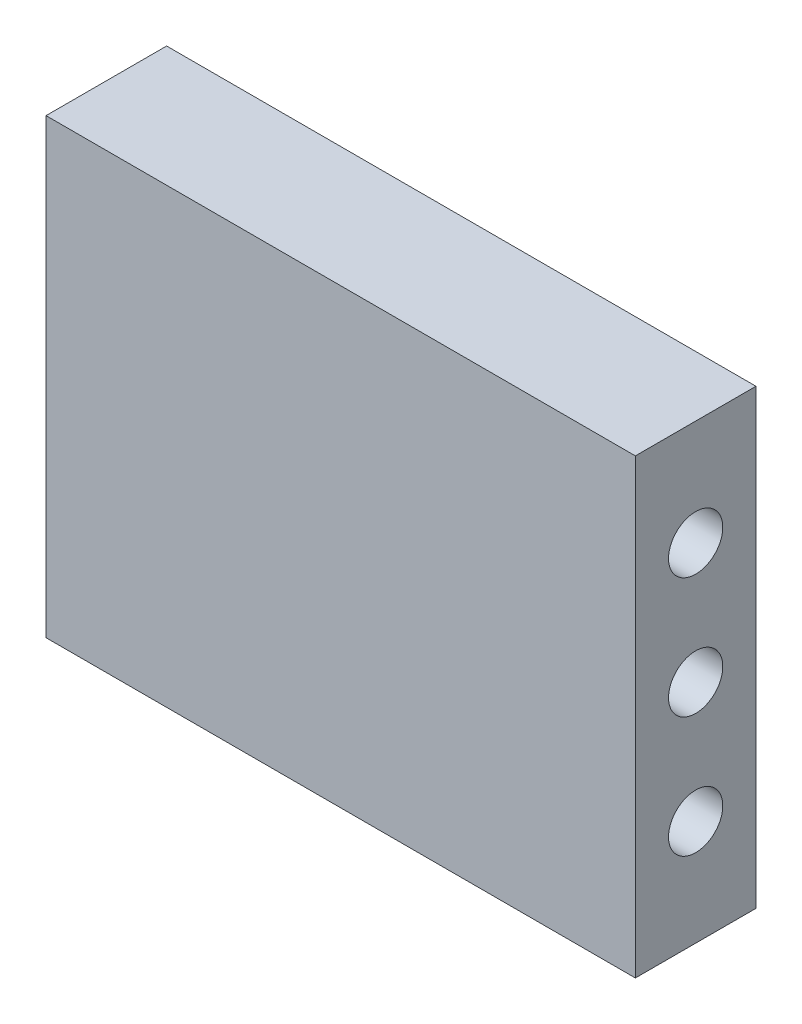
ISO-10303-21;
HEADER;
FILE_DESCRIPTION(('STEP AP214'),'2;1');
FILE_NAME('part.step','',(''),(''),'','','');
FILE_SCHEMA(('AUTOMOTIVE_DESIGN { 1 0 10303 214 1 1 1 1 }'));
ENDSEC;
DATA;
#1=APPLICATION_CONTEXT('core data for automotive mechanical design processes');
#2=APPLICATION_PROTOCOL_DEFINITION('international standard','automotive_design',2000,#1);
#3=PRODUCT_CONTEXT('',#1,'mechanical');
#4=PRODUCT('Part','Part','',(#3));
#5=PRODUCT_RELATED_PRODUCT_CATEGORY('part','',(#4));
#6=PRODUCT_DEFINITION_FORMATION('','',#4);
#7=PRODUCT_DEFINITION_CONTEXT('part definition',#1,'design');
#8=PRODUCT_DEFINITION('design','',#6,#7);
#9=PRODUCT_DEFINITION_SHAPE('','',#8);
#10=(LENGTH_UNIT() NAMED_UNIT(*) SI_UNIT(.MILLI.,.METRE.));
#11=(NAMED_UNIT(*) PLANE_ANGLE_UNIT() SI_UNIT($,.RADIAN.));
#12=(NAMED_UNIT(*) SI_UNIT($,.STERADIAN.) SOLID_ANGLE_UNIT());
#13=UNCERTAINTY_MEASURE_WITH_UNIT(LENGTH_MEASURE(1.E-05),#10,'distance_accuracy_value','');
#14=(GEOMETRIC_REPRESENTATION_CONTEXT(3) GLOBAL_UNCERTAINTY_ASSIGNED_CONTEXT((#13)) GLOBAL_UNIT_ASSIGNED_CONTEXT((#10,
#11,#12)) REPRESENTATION_CONTEXT('',''));
#15=CARTESIAN_POINT('',(0.,0.,0.));
#16=DIRECTION('',(0.,0.,1.));
#17=DIRECTION('',(1.,0.,0.));
#18=AXIS2_PLACEMENT_3D('',#15,#16,#17);
#19=CARTESIAN_POINT('',(-3.702544364314,11.890243902439,8.));
#20=DIRECTION('',(1.,0.,0.));
#21=DIRECTION('',(0.,0.,-1.));
#22=AXIS2_PLACEMENT_3D('',#19,#20,#21);
#23=PLANE('',#22);
#24=CARTESIAN_POINT('',(-3.702544364314,4.89024390243903,4.));
#25=DIRECTION('',(-1.,0.,0.));
#26=DIRECTION('',(0.,0.,1.));
#27=AXIS2_PLACEMENT_3D('',#24,#25,#26);
#28=CIRCLE('',#27,1.8);
#29=CARTESIAN_POINT('',(-3.702544364314,4.89024390243903,5.8));
#30=VERTEX_POINT('',#29);
#31=EDGE_CURVE('E144',#30,#30,#28,.T.);
#32=ORIENTED_EDGE('',*,*,#31,.F.);
#33=EDGE_LOOP('',(#32));
#34=FACE_BOUND('',#33,.T.);
#35=CARTESIAN_POINT('',(-3.702544364314,-3.10975609756097,4.));
#36=DIRECTION('',(-1.,0.,0.));
#37=DIRECTION('',(0.,0.,1.));
#38=AXIS2_PLACEMENT_3D('',#35,#36,#37);
#39=CIRCLE('',#38,1.8);
#40=CARTESIAN_POINT('',(-3.702544364314,-3.10975609756097,5.8));
#41=VERTEX_POINT('',#40);
#42=EDGE_CURVE('E136',#41,#41,#39,.T.);
#43=ORIENTED_EDGE('',*,*,#42,.F.);
#44=EDGE_LOOP('',(#43));
#45=FACE_BOUND('',#44,.T.);
#46=CARTESIAN_POINT('',(-3.702544364314,-11.109756097561,4.));
#47=DIRECTION('',(-1.,0.,0.));
#48=DIRECTION('',(0.,0.,1.));
#49=AXIS2_PLACEMENT_3D('',#46,#47,#48);
#50=CIRCLE('',#49,1.8);
#51=CARTESIAN_POINT('',(-3.702544364314,-11.109756097561,5.8));
#52=VERTEX_POINT('',#51);
#53=EDGE_CURVE('E128',#52,#52,#50,.T.);
#54=ORIENTED_EDGE('',*,*,#53,.F.);
#55=EDGE_LOOP('',(#54));
#56=FACE_BOUND('',#55,.T.);
#57=DIRECTION('',(0.,-1.,0.));
#58=VECTOR('',#57,1.);
#59=CARTESIAN_POINT('',(-3.702544364314,11.890243902439,0.));
#60=LINE('',#59,#58);
#61=CARTESIAN_POINT('',(-3.702544364314,11.890243902439,0.));
#62=VERTEX_POINT('',#61);
#63=CARTESIAN_POINT('',(-3.702544364314,-18.109756097561,0.));
#64=VERTEX_POINT('',#63);
#65=EDGE_CURVE('E107',#62,#64,#60,.T.);
#66=ORIENTED_EDGE('',*,*,#65,.T.);
#67=DIRECTION('',(0.,0.,-1.));
#68=VECTOR('',#67,1.);
#69=CARTESIAN_POINT('',(-3.702544364314,-18.109756097561,8.));
#70=LINE('',#69,#68);
#71=CARTESIAN_POINT('',(-3.702544364314,-18.109756097561,8.));
#72=VERTEX_POINT('',#71);
#73=EDGE_CURVE('E11',#72,#64,#70,.T.);
#74=ORIENTED_EDGE('',*,*,#73,.F.);
#75=DIRECTION('',(0.,-1.,0.));
#76=VECTOR('',#75,1.);
#77=CARTESIAN_POINT('',(-3.702544364314,11.890243902439,8.));
#78=LINE('',#77,#76);
#79=CARTESIAN_POINT('',(-3.702544364314,11.890243902439,8.));
#80=VERTEX_POINT('',#79);
#81=EDGE_CURVE('E91',#80,#72,#78,.T.);
#82=ORIENTED_EDGE('',*,*,#81,.F.);
#83=DIRECTION('',(0.,0.,-1.));
#84=VECTOR('',#83,1.);
#85=CARTESIAN_POINT('',(-3.702544364314,11.890243902439,8.));
#86=LINE('',#85,#84);
#87=EDGE_CURVE('E103',#80,#62,#86,.T.);
#88=ORIENTED_EDGE('',*,*,#87,.T.);
#89=EDGE_LOOP('',(#66,#74,#82,#88));
#90=FACE_BOUND('',#89,.T.);
#91=ADVANCED_FACE('F39',(#34,#45,#56,#90),#23,.F.);
#92=CARTESIAN_POINT('',(-3.702544364314,-18.109756097561,8.));
#93=DIRECTION('',(0.,1.,0.));
#94=DIRECTION('',(0.,0.,1.));
#95=AXIS2_PLACEMENT_3D('',#92,#93,#94);
#96=PLANE('',#95);
#97=DIRECTION('',(1.,0.,0.));
#98=VECTOR('',#97,1.);
#99=CARTESIAN_POINT('',(-3.702544364314,-18.109756097561,0.));
#100=LINE('',#99,#98);
#101=CARTESIAN_POINT('',(35.397455635686,-18.109756097561,0.));
#102=VERTEX_POINT('',#101);
#103=EDGE_CURVE('E96',#64,#102,#100,.T.);
#104=ORIENTED_EDGE('',*,*,#103,.T.);
#105=DIRECTION('',(0.,0.,-1.));
#106=VECTOR('',#105,1.);
#107=CARTESIAN_POINT('',(35.397455635686,-18.109756097561,8.));
#108=LINE('',#107,#106);
#109=CARTESIAN_POINT('',(35.397455635686,-18.109756097561,8.));
#110=VERTEX_POINT('',#109);
#111=EDGE_CURVE('E48',#110,#102,#108,.T.);
#112=ORIENTED_EDGE('',*,*,#111,.F.);
#113=DIRECTION('',(1.,0.,0.));
#114=VECTOR('',#113,1.);
#115=CARTESIAN_POINT('',(-3.702544364314,-18.109756097561,8.));
#116=LINE('',#115,#114);
#117=EDGE_CURVE('E86',#72,#110,#116,.T.);
#118=ORIENTED_EDGE('',*,*,#117,.F.);
#119=ORIENTED_EDGE('',*,*,#73,.T.);
#120=EDGE_LOOP('',(#104,#112,#118,#119));
#121=FACE_BOUND('',#120,.T.);
#122=ADVANCED_FACE('F95',(#121),#96,.F.);
#123=CARTESIAN_POINT('',(35.397455635686,11.890243902439,8.));
#124=DIRECTION('',(-1.,0.,0.));
#125=DIRECTION('',(0.,0.,1.));
#126=AXIS2_PLACEMENT_3D('',#123,#124,#125);
#127=PLANE('',#126);
#128=CARTESIAN_POINT('',(35.397455635686,4.89024390243903,4.));
#129=DIRECTION('',(-1.,0.,0.));
#130=DIRECTION('',(0.,0.,1.));
#131=AXIS2_PLACEMENT_3D('',#128,#129,#130);
#132=CIRCLE('',#131,1.8);
#133=CARTESIAN_POINT('',(35.397455635686,4.89024390243903,5.8));
#134=VERTEX_POINT('',#133);
#135=EDGE_CURVE('E111',#134,#134,#132,.T.);
#136=ORIENTED_EDGE('',*,*,#135,.T.);
#137=EDGE_LOOP('',(#136));
#138=FACE_BOUND('',#137,.T.);
#139=CARTESIAN_POINT('',(35.397455635686,-3.10975609756097,4.));
#140=DIRECTION('',(-1.,0.,0.));
#141=DIRECTION('',(0.,0.,1.));
#142=AXIS2_PLACEMENT_3D('',#139,#140,#141);
#143=CIRCLE('',#142,1.8);
#144=CARTESIAN_POINT('',(35.397455635686,-3.10975609756097,5.8));
#145=VERTEX_POINT('',#144);
#146=EDGE_CURVE('E140',#145,#145,#143,.T.);
#147=ORIENTED_EDGE('',*,*,#146,.T.);
#148=EDGE_LOOP('',(#147));
#149=FACE_BOUND('',#148,.T.);
#150=CARTESIAN_POINT('',(35.397455635686,-11.109756097561,4.));
#151=DIRECTION('',(-1.,0.,0.));
#152=DIRECTION('',(0.,0.,1.));
#153=AXIS2_PLACEMENT_3D('',#150,#151,#152);
#154=CIRCLE('',#153,1.8);
#155=CARTESIAN_POINT('',(35.397455635686,-11.109756097561,5.8));
#156=VERTEX_POINT('',#155);
#157=EDGE_CURVE('E132',#156,#156,#154,.T.);
#158=ORIENTED_EDGE('',*,*,#157,.T.);
#159=EDGE_LOOP('',(#158));
#160=FACE_BOUND('',#159,.T.);
#161=DIRECTION('',(0.,1.,0.));
#162=VECTOR('',#161,1.);
#163=CARTESIAN_POINT('',(35.397455635686,11.890243902439,0.));
#164=LINE('',#163,#162);
#165=CARTESIAN_POINT('',(35.397455635686,11.890243902439,0.));
#166=VERTEX_POINT('',#165);
#167=EDGE_CURVE('E73',#102,#166,#164,.T.);
#168=ORIENTED_EDGE('',*,*,#167,.T.);
#169=DIRECTION('',(0.,0.,-1.));
#170=VECTOR('',#169,1.);
#171=CARTESIAN_POINT('',(35.397455635686,11.890243902439,8.));
#172=LINE('',#171,#170);
#173=CARTESIAN_POINT('',(35.397455635686,11.890243902439,8.));
#174=VERTEX_POINT('',#173);
#175=EDGE_CURVE('E98',#174,#166,#172,.T.);
#176=ORIENTED_EDGE('',*,*,#175,.F.);
#177=DIRECTION('',(0.,1.,0.));
#178=VECTOR('',#177,1.);
#179=CARTESIAN_POINT('',(35.397455635686,11.890243902439,8.));
#180=LINE('',#179,#178);
#181=EDGE_CURVE('E89',#110,#174,#180,.T.);
#182=ORIENTED_EDGE('',*,*,#181,.F.);
#183=ORIENTED_EDGE('',*,*,#111,.T.);
#184=EDGE_LOOP('',(#168,#176,#182,#183));
#185=FACE_BOUND('',#184,.T.);
#186=ADVANCED_FACE('F99',(#138,#149,#160,#185),#127,.F.);
#187=CARTESIAN_POINT('',(-3.702544364314,11.890243902439,8.));
#188=DIRECTION('',(0.,-1.,0.));
#189=DIRECTION('',(1.,0.,0.));
#190=AXIS2_PLACEMENT_3D('',#187,#188,#189);
#191=PLANE('',#190);
#192=DIRECTION('',(-1.,0.,0.));
#193=VECTOR('',#192,1.);
#194=CARTESIAN_POINT('',(-3.702544364314,11.890243902439,0.));
#195=LINE('',#194,#193);
#196=EDGE_CURVE('E79',#166,#62,#195,.T.);
#197=ORIENTED_EDGE('',*,*,#196,.T.);
#198=ORIENTED_EDGE('',*,*,#87,.F.);
#199=DIRECTION('',(-1.,0.,0.));
#200=VECTOR('',#199,1.);
#201=CARTESIAN_POINT('',(-3.702544364314,11.890243902439,8.));
#202=LINE('',#201,#200);
#203=EDGE_CURVE('E56',#174,#80,#202,.T.);
#204=ORIENTED_EDGE('',*,*,#203,.F.);
#205=ORIENTED_EDGE('',*,*,#175,.T.);
#206=EDGE_LOOP('',(#197,#198,#204,#205));
#207=FACE_BOUND('',#206,.T.);
#208=ADVANCED_FACE('F121',(#207),#191,.F.);
#209=CARTESIAN_POINT('',(0.,0.,8.));
#210=DIRECTION('',(0.,0.,1.));
#211=DIRECTION('',(1.,0.,0.));
#212=AXIS2_PLACEMENT_3D('',#209,#210,#211);
#213=PLANE('',#212);
#214=ORIENTED_EDGE('',*,*,#81,.T.);
#215=ORIENTED_EDGE('',*,*,#117,.T.);
#216=ORIENTED_EDGE('',*,*,#181,.T.);
#217=ORIENTED_EDGE('',*,*,#203,.T.);
#218=EDGE_LOOP('',(#214,#215,#216,#217));
#219=FACE_BOUND('',#218,.T.);
#220=ADVANCED_FACE('F87',(#219),#213,.T.);
#221=CARTESIAN_POINT('',(0.,0.,0.));
#222=DIRECTION('',(0.,0.,1.));
#223=DIRECTION('',(1.,0.,0.));
#224=AXIS2_PLACEMENT_3D('',#221,#222,#223);
#225=PLANE('',#224);
#226=ORIENTED_EDGE('',*,*,#65,.F.);
#227=ORIENTED_EDGE('',*,*,#196,.F.);
#228=ORIENTED_EDGE('',*,*,#167,.F.);
#229=ORIENTED_EDGE('',*,*,#103,.F.);
#230=EDGE_LOOP('',(#226,#227,#228,#229));
#231=FACE_BOUND('',#230,.T.);
#232=ADVANCED_FACE('F124',(#231),#225,.F.);
#233=CARTESIAN_POINT('',(35.397455635686,-11.109756097561,4.));
#234=DIRECTION('',(-1.,0.,0.));
#235=DIRECTION('',(0.,0.,1.));
#236=AXIS2_PLACEMENT_3D('',#233,#234,#235);
#237=CYLINDRICAL_SURFACE('',#236,1.8);
#238=ORIENTED_EDGE('',*,*,#157,.F.);
#239=EDGE_LOOP('',(#238));
#240=FACE_BOUND('',#239,.T.);
#241=ORIENTED_EDGE('',*,*,#53,.T.);
#242=EDGE_LOOP('',(#241));
#243=FACE_BOUND('',#242,.T.);
#244=ADVANCED_FACE('F167',(#240,#243),#237,.F.);
#245=CARTESIAN_POINT('',(35.397455635686,-3.10975609756097,4.));
#246=DIRECTION('',(-1.,0.,0.));
#247=DIRECTION('',(0.,0.,1.));
#248=AXIS2_PLACEMENT_3D('',#245,#246,#247);
#249=CYLINDRICAL_SURFACE('',#248,1.8);
#250=ORIENTED_EDGE('',*,*,#146,.F.);
#251=EDGE_LOOP('',(#250));
#252=FACE_BOUND('',#251,.T.);
#253=ORIENTED_EDGE('',*,*,#42,.T.);
#254=EDGE_LOOP('',(#253));
#255=FACE_BOUND('',#254,.T.);
#256=ADVANCED_FACE('F157',(#252,#255),#249,.F.);
#257=CARTESIAN_POINT('',(35.397455635686,4.89024390243903,4.));
#258=DIRECTION('',(-1.,0.,0.));
#259=DIRECTION('',(0.,0.,1.));
#260=AXIS2_PLACEMENT_3D('',#257,#258,#259);
#261=CYLINDRICAL_SURFACE('',#260,1.8);
#262=ORIENTED_EDGE('',*,*,#135,.F.);
#263=EDGE_LOOP('',(#262));
#264=FACE_BOUND('',#263,.T.);
#265=ORIENTED_EDGE('',*,*,#31,.T.);
#266=EDGE_LOOP('',(#265));
#267=FACE_BOUND('',#266,.T.);
#268=ADVANCED_FACE('F154',(#264,#267),#261,.F.);
#269=CLOSED_SHELL('',(#91,#122,#186,#208,#220,#232,#244,#256,#268));
#270=MANIFOLD_SOLID_BREP('B2',#269);
#271=ADVANCED_BREP_SHAPE_REPRESENTATION('',(#18,#270),#14);
#272=SHAPE_DEFINITION_REPRESENTATION(#9,#271);
ENDSEC;
END-ISO-10303-21;
